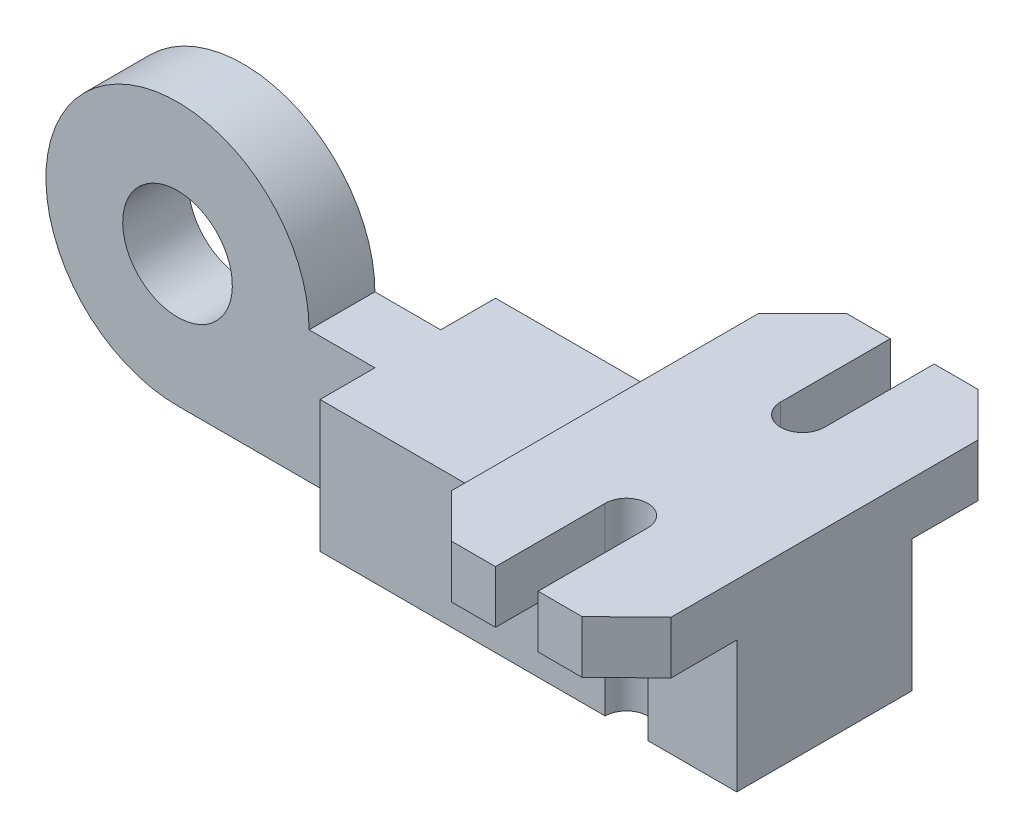
ISO-10303-21;
HEADER;
FILE_DESCRIPTION(('STEP AP214'),'2;1');
FILE_NAME('part.step','',(''),(''),'','','');
FILE_SCHEMA(('AUTOMOTIVE_DESIGN { 1 0 10303 214 1 1 1 1 }'));
ENDSEC;
DATA;
#1=APPLICATION_CONTEXT('core data for automotive mechanical design processes');
#2=APPLICATION_PROTOCOL_DEFINITION('international standard','automotive_design',2000,#1);
#3=PRODUCT_CONTEXT('',#1,'mechanical');
#4=PRODUCT('Part','Part','',(#3));
#5=PRODUCT_RELATED_PRODUCT_CATEGORY('part','',(#4));
#6=PRODUCT_DEFINITION_FORMATION('','',#4);
#7=PRODUCT_DEFINITION_CONTEXT('part definition',#1,'design');
#8=PRODUCT_DEFINITION('design','',#6,#7);
#9=PRODUCT_DEFINITION_SHAPE('','',#8);
#10=(LENGTH_UNIT() NAMED_UNIT(*) SI_UNIT(.MILLI.,.METRE.));
#11=(NAMED_UNIT(*) PLANE_ANGLE_UNIT() SI_UNIT($,.RADIAN.));
#12=(NAMED_UNIT(*) SI_UNIT($,.STERADIAN.) SOLID_ANGLE_UNIT());
#13=UNCERTAINTY_MEASURE_WITH_UNIT(LENGTH_MEASURE(1.E-05),#10,'distance_accuracy_value','');
#14=(GEOMETRIC_REPRESENTATION_CONTEXT(3) GLOBAL_UNCERTAINTY_ASSIGNED_CONTEXT((#13)) GLOBAL_UNIT_ASSIGNED_CONTEXT((#10,
#11,#12)) REPRESENTATION_CONTEXT('',''));
#15=CARTESIAN_POINT('',(0.,0.,0.));
#16=DIRECTION('',(0.,0.,1.));
#17=DIRECTION('',(1.,0.,0.));
#18=AXIS2_PLACEMENT_3D('',#15,#16,#17);
#19=CARTESIAN_POINT('',(-97.5813084364337,0.,0.));
#20=DIRECTION('',(1.,0.,0.));
#21=DIRECTION('',(0.,0.,-1.));
#22=AXIS2_PLACEMENT_3D('',#19,#20,#21);
#23=PLANE('',#22);
#24=DIRECTION('',(0.,-1.,0.));
#25=VECTOR('',#24,1.);
#26=CARTESIAN_POINT('',(-97.5813084364337,0.,13.0693866368896));
#27=LINE('',#26,#25);
#28=CARTESIAN_POINT('',(-97.5813084364337,0.,13.0693866368896));
#29=VERTEX_POINT('',#28);
#30=CARTESIAN_POINT('',(-97.5813084364337,-30.,13.0693866368896));
#31=VERTEX_POINT('',#30);
#32=EDGE_CURVE('E243',#29,#31,#27,.T.);
#33=ORIENTED_EDGE('',*,*,#32,.F.);
#34=DIRECTION('',(0.,0.,1.));
#35=VECTOR('',#34,1.);
#36=CARTESIAN_POINT('',(-97.5813084364337,0.,40.5693866368896));
#37=LINE('',#36,#35);
#38=CARTESIAN_POINT('',(-97.5813084364337,0.,0.569386636889586));
#39=VERTEX_POINT('',#38);
#40=EDGE_CURVE('E270',#39,#29,#37,.T.);
#41=ORIENTED_EDGE('',*,*,#40,.F.);
#42=DIRECTION('',(0.,1.,0.));
#43=VECTOR('',#42,1.);
#44=CARTESIAN_POINT('',(-97.5813084364337,0.,0.569386636889586));
#45=LINE('',#44,#43);
#46=CARTESIAN_POINT('',(-97.5813084364337,-30.,0.569386636889581));
#47=VERTEX_POINT('',#46);
#48=EDGE_CURVE('E266',#47,#39,#45,.T.);
#49=ORIENTED_EDGE('',*,*,#48,.F.);
#50=DIRECTION('',(0.,0.,-1.));
#51=VECTOR('',#50,1.);
#52=CARTESIAN_POINT('',(-97.5813084364337,-30.,40.5693866368896));
#53=LINE('',#52,#51);
#54=EDGE_CURVE('E263',#31,#47,#53,.T.);
#55=ORIENTED_EDGE('',*,*,#54,.F.);
#56=EDGE_LOOP('',(#33,#41,#49,#55));
#57=FACE_BOUND('',#56,.T.);
#58=ADVANCED_FACE('F39',(#57),#23,.F.);
#59=CARTESIAN_POINT('',(-97.5813084364337,0.,40.5693866368896));
#60=DIRECTION('',(0.,0.,1.));
#61=DIRECTION('',(0.,-1.,0.));
#62=AXIS2_PLACEMENT_3D('',#59,#60,#61);
#63=PLANE('',#62);
#64=DIRECTION('',(0.,1.,0.));
#65=VECTOR('',#64,1.);
#66=CARTESIAN_POINT('',(-22.8699736654861,-83.,40.5693866368896));
#67=LINE('',#66,#65);
#68=CARTESIAN_POINT('',(-22.8699736654861,-30.,40.5693866368896));
#69=VERTEX_POINT('',#68);
#70=CARTESIAN_POINT('',(-22.8699736654861,0.,40.5693866368896));
#71=VERTEX_POINT('',#70);
#72=EDGE_CURVE('E254',#69,#71,#67,.T.);
#73=ORIENTED_EDGE('',*,*,#72,.F.);
#74=DIRECTION('',(1.,0.,0.));
#75=VECTOR('',#74,1.);
#76=CARTESIAN_POINT('',(-97.5813084364337,-30.,40.5693866368896));
#77=LINE('',#76,#75);
#78=CARTESIAN_POINT('',(-2.58130843643368,-30.,40.5693866368896));
#79=VERTEX_POINT('',#78);
#80=EDGE_CURVE('E273',#69,#79,#77,.T.);
#81=ORIENTED_EDGE('',*,*,#80,.T.);
#82=DIRECTION('',(0.,-1.,0.));
#83=VECTOR('',#82,1.);
#84=CARTESIAN_POINT('',(-2.58130843643368,0.,40.5693866368896));
#85=LINE('',#84,#83);
#86=CARTESIAN_POINT('',(-2.58130843643368,0.,40.5693866368896));
#87=VERTEX_POINT('',#86);
#88=EDGE_CURVE('E259',#87,#79,#85,.T.);
#89=ORIENTED_EDGE('',*,*,#88,.F.);
#90=DIRECTION('',(1.,0.,0.));
#91=VECTOR('',#90,1.);
#92=CARTESIAN_POINT('',(-97.5813084364337,0.,40.5693866368896));
#93=LINE('',#92,#91);
#94=EDGE_CURVE('E287',#71,#87,#93,.T.);
#95=ORIENTED_EDGE('',*,*,#94,.F.);
#96=EDGE_LOOP('',(#73,#81,#89,#95));
#97=FACE_BOUND('',#96,.T.);
#98=ADVANCED_FACE('F456',(#97),#63,.T.);
#99=CARTESIAN_POINT('',(-97.5813084364337,0.,0.569386636889586));
#100=DIRECTION('',(0.,0.,-1.));
#101=DIRECTION('',(0.,1.,0.));
#102=AXIS2_PLACEMENT_3D('',#99,#100,#101);
#103=PLANE('',#102);
#104=DIRECTION('',(0.,1.,0.));
#105=VECTOR('',#104,1.);
#106=CARTESIAN_POINT('',(-32.5813084364337,-83.,0.569386636889564));
#107=LINE('',#106,#105);
#108=CARTESIAN_POINT('',(-32.5813084364337,-30.,0.569386636889573));
#109=VERTEX_POINT('',#108);
#110=CARTESIAN_POINT('',(-32.5813084364337,0.,0.569386636889564));
#111=VERTEX_POINT('',#110);
#112=EDGE_CURVE('E257',#109,#111,#107,.T.);
#113=ORIENTED_EDGE('',*,*,#112,.F.);
#114=DIRECTION('',(1.,0.,0.));
#115=VECTOR('',#114,1.);
#116=CARTESIAN_POINT('',(-97.5813084364337,-30.,0.569386636889581));
#117=LINE('',#116,#115);
#118=EDGE_CURVE('E290',#47,#109,#117,.T.);
#119=ORIENTED_EDGE('',*,*,#118,.F.);
#120=ORIENTED_EDGE('',*,*,#48,.T.);
#121=DIRECTION('',(1.,0.,0.));
#122=VECTOR('',#121,1.);
#123=CARTESIAN_POINT('',(-97.5813084364337,0.,0.569386636889586));
#124=LINE('',#123,#122);
#125=CARTESIAN_POINT('',(-52.5813084364337,0.,0.569386636889581));
#126=VERTEX_POINT('',#125);
#127=EDGE_CURVE('E285',#39,#126,#124,.T.);
#128=ORIENTED_EDGE('',*,*,#127,.T.);
#129=EDGE_CURVE('E291',#126,#111,#124,.T.);
#130=ORIENTED_EDGE('',*,*,#129,.T.);
#131=EDGE_LOOP('',(#113,#119,#120,#128,#130));
#132=FACE_BOUND('',#131,.T.);
#133=ADVANCED_FACE('F500',(#132),#103,.T.);
#134=CARTESIAN_POINT('',(-27.5813084364337,0.,0.569386636889549));
#135=DIRECTION('',(0.,1.,0.));
#136=DIRECTION('',(0.,0.,1.));
#137=AXIS2_PLACEMENT_3D('',#134,#135,#136);
#138=PLANE('',#137);
#139=ORIENTED_EDGE('',*,*,#129,.F.);
#140=DIRECTION('',(0.,0.,1.));
#141=VECTOR('',#140,1.);
#142=CARTESIAN_POINT('',(-52.5813084364337,0.,-14.4306133631105));
#143=LINE('',#142,#141);
#144=CARTESIAN_POINT('',(-52.5813084364337,0.,-14.4306133631105));
#145=VERTEX_POINT('',#144);
#146=EDGE_CURVE('E341',#145,#126,#143,.T.);
#147=ORIENTED_EDGE('',*,*,#146,.F.);
#148=DIRECTION('',(-0.707106781186548,0.,0.707106781186547));
#149=VECTOR('',#148,1.);
#150=CARTESIAN_POINT('',(-42.5813084364337,0.,-24.4306133631104));
#151=LINE('',#150,#149);
#152=CARTESIAN_POINT('',(-42.5813084364337,0.,-24.4306133631104));
#153=VERTEX_POINT('',#152);
#154=EDGE_CURVE('E338',#153,#145,#151,.T.);
#155=ORIENTED_EDGE('',*,*,#154,.F.);
#156=DIRECTION('',(-1.,0.,0.));
#157=VECTOR('',#156,1.);
#158=CARTESIAN_POINT('',(-32.5813084364337,0.,-24.4306133631105));
#159=LINE('',#158,#157);
#160=CARTESIAN_POINT('',(-32.5813084364337,0.,-24.4306133631105));
#161=VERTEX_POINT('',#160);
#162=EDGE_CURVE('E336',#161,#153,#159,.T.);
#163=ORIENTED_EDGE('',*,*,#162,.F.);
#164=DIRECTION('',(0.,0.,-1.));
#165=VECTOR('',#164,1.);
#166=CARTESIAN_POINT('',(-32.5813084364337,0.,-24.4306133631105));
#167=LINE('',#166,#165);
#168=EDGE_CURVE('E284',#111,#161,#167,.T.);
#169=ORIENTED_EDGE('',*,*,#168,.F.);
#170=EDGE_LOOP('',(#139,#147,#155,#163,#169));
#171=FACE_BOUND('',#170,.T.);
#172=ADVANCED_FACE('F506',(#171),#138,.F.);
#173=CARTESIAN_POINT('',(-22.5813084364337,0.,0.569386636889562));
#174=VERTEX_POINT('',#173);
#175=CARTESIAN_POINT('',(-2.58130843643369,0.,0.569386636889574));
#176=VERTEX_POINT('',#175);
#177=EDGE_CURVE('E292',#174,#176,#124,.T.);
#178=ORIENTED_EDGE('',*,*,#177,.F.);
#179=DIRECTION('',(0.,0.,1.));
#180=VECTOR('',#179,1.);
#181=CARTESIAN_POINT('',(-22.5813084364337,0.,-24.4306133631103));
#182=LINE('',#181,#180);
#183=CARTESIAN_POINT('',(-22.5813084364337,0.,-24.4306133631103));
#184=VERTEX_POINT('',#183);
#185=EDGE_CURVE('E303',#184,#174,#182,.T.);
#186=ORIENTED_EDGE('',*,*,#185,.F.);
#187=DIRECTION('',(-1.,0.,0.));
#188=VECTOR('',#187,1.);
#189=CARTESIAN_POINT('',(-22.5813084364337,0.,-24.4306133631103));
#190=LINE('',#189,#188);
#191=CARTESIAN_POINT('',(-12.5813084364337,0.,-24.4306133631104));
#192=VERTEX_POINT('',#191);
#193=EDGE_CURVE('E364',#192,#184,#190,.T.);
#194=ORIENTED_EDGE('',*,*,#193,.F.);
#195=DIRECTION('',(-0.707106781186548,0.,-0.707106781186547));
#196=VECTOR('',#195,1.);
#197=CARTESIAN_POINT('',(-12.5813084364337,0.,-24.4306133631104));
#198=LINE('',#197,#196);
#199=CARTESIAN_POINT('',(-2.58130843643369,0.,-14.4306133631104));
#200=VERTEX_POINT('',#199);
#201=EDGE_CURVE('E362',#200,#192,#198,.T.);
#202=ORIENTED_EDGE('',*,*,#201,.F.);
#203=DIRECTION('',(0.,0.,-1.));
#204=VECTOR('',#203,1.);
#205=CARTESIAN_POINT('',(-2.58130843643369,0.,-14.4306133631104));
#206=LINE('',#205,#204);
#207=EDGE_CURVE('E358',#176,#200,#206,.T.);
#208=ORIENTED_EDGE('',*,*,#207,.F.);
#209=EDGE_LOOP('',(#178,#186,#194,#202,#208));
#210=FACE_BOUND('',#209,.T.);
#211=ADVANCED_FACE('F462',(#210),#138,.F.);
#212=CARTESIAN_POINT('',(-52.5813084364337,0.,40.5693866368896));
#213=VERTEX_POINT('',#212);
#214=CARTESIAN_POINT('',(-52.5813084364337,0.,55.5693866368895));
#215=VERTEX_POINT('',#214);
#216=EDGE_CURVE('E340',#213,#215,#143,.T.);
#217=ORIENTED_EDGE('',*,*,#216,.F.);
#218=CARTESIAN_POINT('',(-32.5813084364337,0.,40.5693866368896));
#219=VERTEX_POINT('',#218);
#220=EDGE_CURVE('E286',#213,#219,#93,.T.);
#221=ORIENTED_EDGE('',*,*,#220,.T.);
#222=DIRECTION('',(0.,0.,-1.));
#223=VECTOR('',#222,1.);
#224=CARTESIAN_POINT('',(-32.5813084364337,0.,65.5693866368895));
#225=LINE('',#224,#223);
#226=CARTESIAN_POINT('',(-32.5813084364337,0.,65.5693866368895));
#227=VERTEX_POINT('',#226);
#228=EDGE_CURVE('E349',#227,#219,#225,.T.);
#229=ORIENTED_EDGE('',*,*,#228,.F.);
#230=DIRECTION('',(1.,0.,0.));
#231=VECTOR('',#230,1.);
#232=CARTESIAN_POINT('',(-42.5813084364337,0.,65.5693866368895));
#233=LINE('',#232,#231);
#234=CARTESIAN_POINT('',(-42.5813084364337,0.,65.5693866368895));
#235=VERTEX_POINT('',#234);
#236=EDGE_CURVE('E347',#235,#227,#233,.T.);
#237=ORIENTED_EDGE('',*,*,#236,.F.);
#238=DIRECTION('',(0.707106781186547,0.,0.707106781186548));
#239=VECTOR('',#238,1.);
#240=CARTESIAN_POINT('',(-52.5813084364337,0.,55.5693866368895));
#241=LINE('',#240,#239);
#242=EDGE_CURVE('E344',#215,#235,#241,.T.);
#243=ORIENTED_EDGE('',*,*,#242,.F.);
#244=EDGE_LOOP('',(#217,#221,#229,#237,#243));
#245=FACE_BOUND('',#244,.T.);
#246=ADVANCED_FACE('F674',(#245),#138,.F.);
#247=CARTESIAN_POINT('',(-32.5813084364337,12.,-24.4306133631105));
#248=DIRECTION('',(-1.,0.,0.));
#249=DIRECTION('',(0.,0.,1.));
#250=AXIS2_PLACEMENT_3D('',#247,#248,#249);
#251=PLANE('',#250);
#252=ORIENTED_EDGE('',*,*,#168,.T.);
#253=DIRECTION('',(0.,-1.,0.));
#254=VECTOR('',#253,1.);
#255=CARTESIAN_POINT('',(-32.5813084364337,12.,-24.4306133631105));
#256=LINE('',#255,#254);
#257=CARTESIAN_POINT('',(-32.5813084364337,12.,-24.4306133631105));
#258=VERTEX_POINT('',#257);
#259=EDGE_CURVE('E411',#258,#161,#256,.T.);
#260=ORIENTED_EDGE('',*,*,#259,.F.);
#261=DIRECTION('',(0.,0.,-1.));
#262=VECTOR('',#261,1.);
#263=CARTESIAN_POINT('',(-32.5813084364337,12.,-24.4306133631105));
#264=LINE('',#263,#262);
#265=CARTESIAN_POINT('',(-32.5813084364337,12.,0.569386636889548));
#266=VERTEX_POINT('',#265);
#267=EDGE_CURVE('E299',#266,#258,#264,.T.);
#268=ORIENTED_EDGE('',*,*,#267,.F.);
#269=DIRECTION('',(0.,-1.,0.));
#270=VECTOR('',#269,1.);
#271=CARTESIAN_POINT('',(-32.5813084364337,12.,0.569386636889548));
#272=LINE('',#271,#270);
#273=EDGE_CURVE('E333',#266,#111,#272,.T.);
#274=ORIENTED_EDGE('',*,*,#273,.T.);
#275=EDGE_LOOP('',(#252,#260,#268,#274));
#276=FACE_BOUND('',#275,.T.);
#277=ADVANCED_FACE('F41',(#276),#251,.F.);
#278=CARTESIAN_POINT('',(-32.5813084364337,12.,-24.4306133631105));
#279=DIRECTION('',(0.,0.,1.));
#280=DIRECTION('',(1.,0.,0.));
#281=AXIS2_PLACEMENT_3D('',#278,#279,#280);
#282=PLANE('',#281);
#283=ORIENTED_EDGE('',*,*,#162,.T.);
#284=DIRECTION('',(0.,-1.,0.));
#285=VECTOR('',#284,1.);
#286=CARTESIAN_POINT('',(-42.5813084364337,12.,-24.4306133631104));
#287=LINE('',#286,#285);
#288=CARTESIAN_POINT('',(-42.5813084364337,12.,-24.4306133631104));
#289=VERTEX_POINT('',#288);
#290=EDGE_CURVE('E408',#289,#153,#287,.T.);
#291=ORIENTED_EDGE('',*,*,#290,.F.);
#292=DIRECTION('',(-1.,0.,0.));
#293=VECTOR('',#292,1.);
#294=CARTESIAN_POINT('',(-32.5813084364337,12.,-24.4306133631105));
#295=LINE('',#294,#293);
#296=EDGE_CURVE('E302',#258,#289,#295,.T.);
#297=ORIENTED_EDGE('',*,*,#296,.F.);
#298=ORIENTED_EDGE('',*,*,#259,.T.);
#299=EDGE_LOOP('',(#283,#291,#297,#298));
#300=FACE_BOUND('',#299,.T.);
#301=ADVANCED_FACE('F519',(#300),#282,.F.);
#302=CARTESIAN_POINT('',(-42.5813084364337,12.,-24.4306133631104));
#303=DIRECTION('',(0.707106781186547,0.,0.707106781186548));
#304=DIRECTION('',(0.707106781186548,0.,-0.707106781186547));
#305=AXIS2_PLACEMENT_3D('',#302,#303,#304);
#306=PLANE('',#305);
#307=ORIENTED_EDGE('',*,*,#154,.T.);
#308=DIRECTION('',(0.,-1.,0.));
#309=VECTOR('',#308,1.);
#310=CARTESIAN_POINT('',(-52.5813084364337,12.,-14.4306133631105));
#311=LINE('',#310,#309);
#312=CARTESIAN_POINT('',(-52.5813084364337,12.,-14.4306133631105));
#313=VERTEX_POINT('',#312);
#314=EDGE_CURVE('E405',#313,#145,#311,.T.);
#315=ORIENTED_EDGE('',*,*,#314,.F.);
#316=DIRECTION('',(-0.707106781186548,0.,0.707106781186547));
#317=VECTOR('',#316,1.);
#318=CARTESIAN_POINT('',(-42.5813084364337,12.,-24.4306133631104));
#319=LINE('',#318,#317);
#320=EDGE_CURVE('E305',#289,#313,#319,.T.);
#321=ORIENTED_EDGE('',*,*,#320,.F.);
#322=ORIENTED_EDGE('',*,*,#290,.T.);
#323=EDGE_LOOP('',(#307,#315,#321,#322));
#324=FACE_BOUND('',#323,.T.);
#325=ADVANCED_FACE('F515',(#324),#306,.F.);
#326=CARTESIAN_POINT('',(-52.5813084364337,12.,-14.4306133631105));
#327=DIRECTION('',(1.,0.,0.));
#328=DIRECTION('',(0.,0.,-1.));
#329=AXIS2_PLACEMENT_3D('',#326,#327,#328);
#330=PLANE('',#329);
#331=ORIENTED_EDGE('',*,*,#146,.T.);
#332=EDGE_CURVE('E345',#126,#213,#143,.T.);
#333=ORIENTED_EDGE('',*,*,#332,.T.);
#334=ORIENTED_EDGE('',*,*,#216,.T.);
#335=DIRECTION('',(0.,-1.,0.));
#336=VECTOR('',#335,1.);
#337=CARTESIAN_POINT('',(-52.5813084364337,12.,55.5693866368895));
#338=LINE('',#337,#336);
#339=CARTESIAN_POINT('',(-52.5813084364337,12.,55.5693866368895));
#340=VERTEX_POINT('',#339);
#341=EDGE_CURVE('E402',#340,#215,#338,.T.);
#342=ORIENTED_EDGE('',*,*,#341,.F.);
#343=DIRECTION('',(0.,0.,1.));
#344=VECTOR('',#343,1.);
#345=CARTESIAN_POINT('',(-52.5813084364337,12.,-14.4306133631105));
#346=LINE('',#345,#344);
#347=EDGE_CURVE('E307',#313,#340,#346,.T.);
#348=ORIENTED_EDGE('',*,*,#347,.F.);
#349=ORIENTED_EDGE('',*,*,#314,.T.);
#350=EDGE_LOOP('',(#331,#333,#334,#342,#348,#349));
#351=FACE_BOUND('',#350,.T.);
#352=ADVANCED_FACE('F509',(#351),#330,.F.);
#353=CARTESIAN_POINT('',(-52.5813084364337,12.,55.5693866368895));
#354=DIRECTION('',(0.707106781186548,0.,-0.707106781186547));
#355=DIRECTION('',(-0.707106781186547,0.,-0.707106781186548));
#356=AXIS2_PLACEMENT_3D('',#353,#354,#355);
#357=PLANE('',#356);
#358=ORIENTED_EDGE('',*,*,#242,.T.);
#359=DIRECTION('',(0.,-1.,0.));
#360=VECTOR('',#359,1.);
#361=CARTESIAN_POINT('',(-42.5813084364337,12.,65.5693866368895));
#362=LINE('',#361,#360);
#363=CARTESIAN_POINT('',(-42.5813084364337,12.,65.5693866368895));
#364=VERTEX_POINT('',#363);
#365=EDGE_CURVE('E399',#364,#235,#362,.T.);
#366=ORIENTED_EDGE('',*,*,#365,.F.);
#367=DIRECTION('',(0.707106781186547,0.,0.707106781186548));
#368=VECTOR('',#367,1.);
#369=CARTESIAN_POINT('',(-52.5813084364337,12.,55.5693866368895));
#370=LINE('',#369,#368);
#371=EDGE_CURVE('E309',#340,#364,#370,.T.);
#372=ORIENTED_EDGE('',*,*,#371,.F.);
#373=ORIENTED_EDGE('',*,*,#341,.T.);
#374=EDGE_LOOP('',(#358,#366,#372,#373));
#375=FACE_BOUND('',#374,.T.);
#376=ADVANCED_FACE('F755',(#375),#357,.F.);
#377=CARTESIAN_POINT('',(-42.5813084364337,12.,65.5693866368895));
#378=DIRECTION('',(0.,0.,-1.));
#379=DIRECTION('',(-1.,0.,0.));
#380=AXIS2_PLACEMENT_3D('',#377,#378,#379);
#381=PLANE('',#380);
#382=ORIENTED_EDGE('',*,*,#236,.T.);
#383=DIRECTION('',(0.,-1.,0.));
#384=VECTOR('',#383,1.);
#385=CARTESIAN_POINT('',(-32.5813084364337,12.,65.5693866368895));
#386=LINE('',#385,#384);
#387=CARTESIAN_POINT('',(-32.5813084364337,12.,65.5693866368895));
#388=VERTEX_POINT('',#387);
#389=EDGE_CURVE('E396',#388,#227,#386,.T.);
#390=ORIENTED_EDGE('',*,*,#389,.F.);
#391=DIRECTION('',(1.,0.,0.));
#392=VECTOR('',#391,1.);
#393=CARTESIAN_POINT('',(-42.5813084364337,12.,65.5693866368895));
#394=LINE('',#393,#392);
#395=EDGE_CURVE('E311',#364,#388,#394,.T.);
#396=ORIENTED_EDGE('',*,*,#395,.F.);
#397=ORIENTED_EDGE('',*,*,#365,.T.);
#398=EDGE_LOOP('',(#382,#390,#396,#397));
#399=FACE_BOUND('',#398,.T.);
#400=ADVANCED_FACE('F747',(#399),#381,.F.);
#401=CARTESIAN_POINT('',(-32.5813084364337,12.,65.5693866368895));
#402=DIRECTION('',(-1.,0.,0.));
#403=DIRECTION('',(0.,0.,1.));
#404=AXIS2_PLACEMENT_3D('',#401,#402,#403);
#405=PLANE('',#404);
#406=ORIENTED_EDGE('',*,*,#228,.T.);
#407=DIRECTION('',(0.,-1.,0.));
#408=VECTOR('',#407,1.);
#409=CARTESIAN_POINT('',(-32.5813084364337,12.,40.5693866368895));
#410=LINE('',#409,#408);
#411=CARTESIAN_POINT('',(-32.5813084364337,12.,40.5693866368895));
#412=VERTEX_POINT('',#411);
#413=EDGE_CURVE('E393',#412,#219,#410,.T.);
#414=ORIENTED_EDGE('',*,*,#413,.F.);
#415=DIRECTION('',(0.,0.,-1.));
#416=VECTOR('',#415,1.);
#417=CARTESIAN_POINT('',(-32.5813084364337,12.,65.5693866368895));
#418=LINE('',#417,#416);
#419=EDGE_CURVE('E313',#388,#412,#418,.T.);
#420=ORIENTED_EDGE('',*,*,#419,.F.);
#421=ORIENTED_EDGE('',*,*,#389,.T.);
#422=EDGE_LOOP('',(#406,#414,#420,#421));
#423=FACE_BOUND('',#422,.T.);
#424=ADVANCED_FACE('F482',(#423),#405,.F.);
#425=CARTESIAN_POINT('',(-27.7256410509599,12.,40.5693866368896));
#426=DIRECTION('',(0.,-1.,0.));
#427=DIRECTION('',(0.,0.,-1.));
#428=AXIS2_PLACEMENT_3D('',#425,#426,#427);
#429=CYLINDRICAL_SURFACE('',#428,4.8556673854738);
#430=ORIENTED_EDGE('',*,*,#413,.T.);
#431=DIRECTION('',(0.,1.,0.));
#432=VECTOR('',#431,1.);
#433=CARTESIAN_POINT('',(-32.5813084364337,-83.,40.5693866368896));
#434=LINE('',#433,#432);
#435=CARTESIAN_POINT('',(-32.5813084364337,-30.,40.5693866368896));
#436=VERTEX_POINT('',#435);
#437=EDGE_CURVE('E251',#219,#436,#434,.F.);
#438=ORIENTED_EDGE('',*,*,#437,.T.);
#439=CARTESIAN_POINT('',(-27.7256410509599,-30.,40.5693866368896));
#440=DIRECTION('',(0.,-1.,0.));
#441=DIRECTION('',(0.,0.,-1.));
#442=AXIS2_PLACEMENT_3D('',#439,#440,#441);
#443=CIRCLE('',#442,4.8556673854738);
#444=EDGE_CURVE('E47',#436,#69,#443,.T.);
#445=ORIENTED_EDGE('',*,*,#444,.T.);
#446=ORIENTED_EDGE('',*,*,#72,.T.);
#447=DIRECTION('',(0.,-1.,0.));
#448=VECTOR('',#447,1.);
#449=CARTESIAN_POINT('',(-22.8699736654861,12.,40.5693866368896));
#450=LINE('',#449,#448);
#451=CARTESIAN_POINT('',(-22.8699736654861,12.,40.5693866368896));
#452=VERTEX_POINT('',#451);
#453=EDGE_CURVE('E390',#452,#71,#450,.T.);
#454=ORIENTED_EDGE('',*,*,#453,.F.);
#455=CARTESIAN_POINT('',(-27.7256410509599,12.,40.5693866368896));
#456=DIRECTION('',(0.,-1.,0.));
#457=DIRECTION('',(0.,0.,1.));
#458=AXIS2_PLACEMENT_3D('',#455,#456,#457);
#459=CIRCLE('',#458,4.8556673854738);
#460=EDGE_CURVE('E315',#412,#452,#459,.T.);
#461=ORIENTED_EDGE('',*,*,#460,.F.);
#462=EDGE_LOOP('',(#430,#438,#445,#446,#454,#461));
#463=FACE_BOUND('',#462,.T.);
#464=ADVANCED_FACE('F454',(#463),#429,.F.);
#465=CARTESIAN_POINT('',(-22.8699736654861,12.,65.5693866368896));
#466=DIRECTION('',(1.,0.,0.));
#467=DIRECTION('',(0.,0.,-1.));
#468=AXIS2_PLACEMENT_3D('',#465,#466,#467);
#469=PLANE('',#468);
#470=DIRECTION('',(0.,0.,1.));
#471=VECTOR('',#470,1.);
#472=CARTESIAN_POINT('',(-22.8699736654861,0.,65.5693866368896));
#473=LINE('',#472,#471);
#474=CARTESIAN_POINT('',(-22.8699736654861,0.,65.5693866368896));
#475=VERTEX_POINT('',#474);
#476=EDGE_CURVE('E352',#71,#475,#473,.T.);
#477=ORIENTED_EDGE('',*,*,#476,.T.);
#478=DIRECTION('',(0.,-1.,0.));
#479=VECTOR('',#478,1.);
#480=CARTESIAN_POINT('',(-22.8699736654861,12.,65.5693866368896));
#481=LINE('',#480,#479);
#482=CARTESIAN_POINT('',(-22.8699736654861,12.,65.5693866368896));
#483=VERTEX_POINT('',#482);
#484=EDGE_CURVE('E387',#483,#475,#481,.T.);
#485=ORIENTED_EDGE('',*,*,#484,.F.);
#486=DIRECTION('',(0.,0.,1.));
#487=VECTOR('',#486,1.);
#488=CARTESIAN_POINT('',(-22.8699736654861,12.,65.5693866368896));
#489=LINE('',#488,#487);
#490=EDGE_CURVE('E317',#452,#483,#489,.T.);
#491=ORIENTED_EDGE('',*,*,#490,.F.);
#492=ORIENTED_EDGE('',*,*,#453,.T.);
#493=EDGE_LOOP('',(#477,#485,#491,#492));
#494=FACE_BOUND('',#493,.T.);
#495=ADVANCED_FACE('F451',(#494),#469,.F.);
#496=CARTESIAN_POINT('',(-12.8699736654861,12.,65.5693866368896));
#497=DIRECTION('',(0.,0.,-1.));
#498=DIRECTION('',(-1.,0.,0.));
#499=AXIS2_PLACEMENT_3D('',#496,#497,#498);
#500=PLANE('',#499);
#501=DIRECTION('',(1.,0.,0.));
#502=VECTOR('',#501,1.);
#503=CARTESIAN_POINT('',(-12.8699736654861,0.,65.5693866368896));
#504=LINE('',#503,#502);
#505=CARTESIAN_POINT('',(-12.8699736654861,0.,65.5693866368896));
#506=VERTEX_POINT('',#505);
#507=EDGE_CURVE('E354',#475,#506,#504,.T.);
#508=ORIENTED_EDGE('',*,*,#507,.T.);
#509=DIRECTION('',(0.,-1.,0.));
#510=VECTOR('',#509,1.);
#511=CARTESIAN_POINT('',(-12.8699736654861,12.,65.5693866368896));
#512=LINE('',#511,#510);
#513=CARTESIAN_POINT('',(-12.8699736654861,12.,65.5693866368896));
#514=VERTEX_POINT('',#513);
#515=EDGE_CURVE('E384',#514,#506,#512,.T.);
#516=ORIENTED_EDGE('',*,*,#515,.F.);
#517=DIRECTION('',(1.,0.,0.));
#518=VECTOR('',#517,1.);
#519=CARTESIAN_POINT('',(-12.8699736654861,12.,65.5693866368896));
#520=LINE('',#519,#518);
#521=EDGE_CURVE('E319',#483,#514,#520,.T.);
#522=ORIENTED_EDGE('',*,*,#521,.F.);
#523=ORIENTED_EDGE('',*,*,#484,.T.);
#524=EDGE_LOOP('',(#508,#516,#522,#523));
#525=FACE_BOUND('',#524,.T.);
#526=ADVANCED_FACE('F446',(#525),#500,.F.);
#527=CARTESIAN_POINT('',(-2.58130843643368,12.,55.5693866368896));
#528=DIRECTION('',(-0.69697559014587,0.,-0.717094851983206));
#529=DIRECTION('',(-0.717094851983206,0.,0.69697559014587));
#530=AXIS2_PLACEMENT_3D('',#527,#528,#529);
#531=PLANE('',#530);
#532=DIRECTION('',(0.717094851983207,0.,-0.69697559014587));
#533=VECTOR('',#532,1.);
#534=CARTESIAN_POINT('',(-2.58130843643368,0.,55.5693866368896));
#535=LINE('',#534,#533);
#536=CARTESIAN_POINT('',(-2.58130843643368,0.,55.5693866368896));
#537=VERTEX_POINT('',#536);
#538=EDGE_CURVE('E356',#506,#537,#535,.T.);
#539=ORIENTED_EDGE('',*,*,#538,.T.);
#540=DIRECTION('',(0.,-1.,0.));
#541=VECTOR('',#540,1.);
#542=CARTESIAN_POINT('',(-2.58130843643368,12.,55.5693866368896));
#543=LINE('',#542,#541);
#544=CARTESIAN_POINT('',(-2.58130843643368,12.,55.5693866368896));
#545=VERTEX_POINT('',#544);
#546=EDGE_CURVE('E381',#545,#537,#543,.T.);
#547=ORIENTED_EDGE('',*,*,#546,.F.);
#548=DIRECTION('',(0.717094851983207,0.,-0.69697559014587));
#549=VECTOR('',#548,1.);
#550=CARTESIAN_POINT('',(-2.58130843643368,12.,55.5693866368896));
#551=LINE('',#550,#549);
#552=EDGE_CURVE('E321',#514,#545,#551,.T.);
#553=ORIENTED_EDGE('',*,*,#552,.F.);
#554=ORIENTED_EDGE('',*,*,#515,.T.);
#555=EDGE_LOOP('',(#539,#547,#553,#554));
#556=FACE_BOUND('',#555,.T.);
#557=ADVANCED_FACE('F443',(#556),#531,.F.);
#558=CARTESIAN_POINT('',(-2.58130843643369,12.,-14.4306133631104));
#559=DIRECTION('',(-1.,0.,0.));
#560=DIRECTION('',(0.,0.,1.));
#561=AXIS2_PLACEMENT_3D('',#558,#559,#560);
#562=PLANE('',#561);
#563=EDGE_CURVE('E359',#537,#87,#206,.T.);
#564=ORIENTED_EDGE('',*,*,#563,.T.);
#565=ORIENTED_EDGE('',*,*,#88,.T.);
#566=DIRECTION('',(0.,0.,-1.));
#567=VECTOR('',#566,1.);
#568=CARTESIAN_POINT('',(-2.58130843643368,-30.,40.5693866368896));
#569=LINE('',#568,#567);
#570=CARTESIAN_POINT('',(-2.58130843643369,-30.,0.569386636889569));
#571=VERTEX_POINT('',#570);
#572=EDGE_CURVE('E276',#79,#571,#569,.T.);
#573=ORIENTED_EDGE('',*,*,#572,.T.);
#574=DIRECTION('',(0.,1.,0.));
#575=VECTOR('',#574,1.);
#576=CARTESIAN_POINT('',(-2.58130843643369,0.,0.569386636889574));
#577=LINE('',#576,#575);
#578=EDGE_CURVE('E264',#571,#176,#577,.T.);
#579=ORIENTED_EDGE('',*,*,#578,.T.);
#580=ORIENTED_EDGE('',*,*,#207,.T.);
#581=DIRECTION('',(0.,-1.,0.));
#582=VECTOR('',#581,1.);
#583=CARTESIAN_POINT('',(-2.58130843643369,12.,-14.4306133631104));
#584=LINE('',#583,#582);
#585=CARTESIAN_POINT('',(-2.58130843643369,12.,-14.4306133631104));
#586=VERTEX_POINT('',#585);
#587=EDGE_CURVE('E378',#586,#200,#584,.T.);
#588=ORIENTED_EDGE('',*,*,#587,.F.);
#589=DIRECTION('',(0.,0.,-1.));
#590=VECTOR('',#589,1.);
#591=CARTESIAN_POINT('',(-2.58130843643369,12.,-14.4306133631104));
#592=LINE('',#591,#590);
#593=EDGE_CURVE('E323',#545,#586,#592,.T.);
#594=ORIENTED_EDGE('',*,*,#593,.F.);
#595=ORIENTED_EDGE('',*,*,#546,.T.);
#596=EDGE_LOOP('',(#564,#565,#573,#579,#580,#588,#594,#595));
#597=FACE_BOUND('',#596,.T.);
#598=ADVANCED_FACE('F437',(#597),#562,.F.);
#599=CARTESIAN_POINT('',(-12.5813084364337,12.,-24.4306133631104));
#600=DIRECTION('',(-0.707106781186547,0.,0.707106781186548));
#601=DIRECTION('',(0.707106781186548,0.,0.707106781186547));
#602=AXIS2_PLACEMENT_3D('',#599,#600,#601);
#603=PLANE('',#602);
#604=ORIENTED_EDGE('',*,*,#201,.T.);
#605=DIRECTION('',(0.,-1.,0.));
#606=VECTOR('',#605,1.);
#607=CARTESIAN_POINT('',(-12.5813084364337,12.,-24.4306133631104));
#608=LINE('',#607,#606);
#609=CARTESIAN_POINT('',(-12.5813084364337,12.,-24.4306133631104));
#610=VERTEX_POINT('',#609);
#611=EDGE_CURVE('E375',#610,#192,#608,.T.);
#612=ORIENTED_EDGE('',*,*,#611,.F.);
#613=DIRECTION('',(-0.707106781186548,0.,-0.707106781186547));
#614=VECTOR('',#613,1.);
#615=CARTESIAN_POINT('',(-12.5813084364337,12.,-24.4306133631104));
#616=LINE('',#615,#614);
#617=EDGE_CURVE('E325',#586,#610,#616,.T.);
#618=ORIENTED_EDGE('',*,*,#617,.F.);
#619=ORIENTED_EDGE('',*,*,#587,.T.);
#620=EDGE_LOOP('',(#604,#612,#618,#619));
#621=FACE_BOUND('',#620,.T.);
#622=ADVANCED_FACE('F467',(#621),#603,.F.);
#623=CARTESIAN_POINT('',(-22.5813084364337,12.,-24.4306133631103));
#624=DIRECTION('',(0.,0.,1.));
#625=DIRECTION('',(1.,0.,0.));
#626=AXIS2_PLACEMENT_3D('',#623,#624,#625);
#627=PLANE('',#626);
#628=ORIENTED_EDGE('',*,*,#193,.T.);
#629=DIRECTION('',(0.,-1.,0.));
#630=VECTOR('',#629,1.);
#631=CARTESIAN_POINT('',(-22.5813084364337,12.,-24.4306133631103));
#632=LINE('',#631,#630);
#633=CARTESIAN_POINT('',(-22.5813084364337,12.,-24.4306133631103));
#634=VERTEX_POINT('',#633);
#635=EDGE_CURVE('E372',#634,#184,#632,.T.);
#636=ORIENTED_EDGE('',*,*,#635,.F.);
#637=DIRECTION('',(-1.,0.,0.));
#638=VECTOR('',#637,1.);
#639=CARTESIAN_POINT('',(-22.5813084364337,12.,-24.4306133631103));
#640=LINE('',#639,#638);
#641=EDGE_CURVE('E327',#610,#634,#640,.T.);
#642=ORIENTED_EDGE('',*,*,#641,.F.);
#643=ORIENTED_EDGE('',*,*,#611,.T.);
#644=EDGE_LOOP('',(#628,#636,#642,#643));
#645=FACE_BOUND('',#644,.T.);
#646=ADVANCED_FACE('F471',(#645),#627,.F.);
#647=CARTESIAN_POINT('',(-22.5813084364337,12.,-24.4306133631103));
#648=DIRECTION('',(1.,0.,0.));
#649=DIRECTION('',(0.,0.,-1.));
#650=AXIS2_PLACEMENT_3D('',#647,#648,#649);
#651=PLANE('',#650);
#652=ORIENTED_EDGE('',*,*,#185,.T.);
#653=DIRECTION('',(0.,-1.,0.));
#654=VECTOR('',#653,1.);
#655=CARTESIAN_POINT('',(-22.5813084364337,12.,0.569386636889602));
#656=LINE('',#655,#654);
#657=CARTESIAN_POINT('',(-22.5813084364337,12.,0.569386636889602));
#658=VERTEX_POINT('',#657);
#659=EDGE_CURVE('E370',#658,#174,#656,.T.);
#660=ORIENTED_EDGE('',*,*,#659,.F.);
#661=DIRECTION('',(0.,0.,1.));
#662=VECTOR('',#661,1.);
#663=CARTESIAN_POINT('',(-22.5813084364337,12.,-24.4306133631103));
#664=LINE('',#663,#662);
#665=EDGE_CURVE('E329',#634,#658,#664,.T.);
#666=ORIENTED_EDGE('',*,*,#665,.F.);
#667=ORIENTED_EDGE('',*,*,#635,.T.);
#668=EDGE_LOOP('',(#652,#660,#666,#667));
#669=FACE_BOUND('',#668,.T.);
#670=ADVANCED_FACE('F615',(#669),#651,.F.);
#671=CARTESIAN_POINT('',(-27.5813084364337,12.,0.569386636889549));
#672=DIRECTION('',(0.,-1.,0.));
#673=DIRECTION('',(0.,0.,-1.));
#674=AXIS2_PLACEMENT_3D('',#671,#672,#673);
#675=CYLINDRICAL_SURFACE('',#674,5.);
#676=ORIENTED_EDGE('',*,*,#659,.T.);
#677=DIRECTION('',(0.,1.,0.));
#678=VECTOR('',#677,1.);
#679=CARTESIAN_POINT('',(-22.5813084364337,-83.,0.569386636889562));
#680=LINE('',#679,#678);
#681=CARTESIAN_POINT('',(-22.5813084364337,-30.,0.569386636889572));
#682=VERTEX_POINT('',#681);
#683=EDGE_CURVE('E61',#174,#682,#680,.F.);
#684=ORIENTED_EDGE('',*,*,#683,.T.);
#685=CARTESIAN_POINT('',(-27.5813084364337,-30.,0.569386636889577));
#686=DIRECTION('',(0.,-1.,0.));
#687=DIRECTION('',(0.,0.,-1.));
#688=AXIS2_PLACEMENT_3D('',#685,#686,#687);
#689=CIRCLE('',#688,4.99999999999999);
#690=EDGE_CURVE('E11',#682,#109,#689,.T.);
#691=ORIENTED_EDGE('',*,*,#690,.T.);
#692=ORIENTED_EDGE('',*,*,#112,.T.);
#693=ORIENTED_EDGE('',*,*,#273,.F.);
#694=CARTESIAN_POINT('',(-27.5813084364337,12.,0.569386636889549));
#695=DIRECTION('',(0.,-1.,0.));
#696=DIRECTION('',(0.,0.,1.));
#697=AXIS2_PLACEMENT_3D('',#694,#695,#696);
#698=CIRCLE('',#697,5.);
#699=EDGE_CURVE('E331',#658,#266,#698,.T.);
#700=ORIENTED_EDGE('',*,*,#699,.F.);
#701=EDGE_LOOP('',(#676,#684,#691,#692,#693,#700));
#702=FACE_BOUND('',#701,.T.);
#703=ADVANCED_FACE('F524',(#702),#675,.F.);
#704=CARTESIAN_POINT('',(-27.5813084364337,12.,0.569386636889549));
#705=DIRECTION('',(0.,1.,0.));
#706=DIRECTION('',(0.,0.,1.));
#707=AXIS2_PLACEMENT_3D('',#704,#705,#706);
#708=PLANE('',#707);
#709=ORIENTED_EDGE('',*,*,#267,.T.);
#710=ORIENTED_EDGE('',*,*,#296,.T.);
#711=ORIENTED_EDGE('',*,*,#320,.T.);
#712=ORIENTED_EDGE('',*,*,#347,.T.);
#713=ORIENTED_EDGE('',*,*,#371,.T.);
#714=ORIENTED_EDGE('',*,*,#395,.T.);
#715=ORIENTED_EDGE('',*,*,#419,.T.);
#716=ORIENTED_EDGE('',*,*,#460,.T.);
#717=ORIENTED_EDGE('',*,*,#490,.T.);
#718=ORIENTED_EDGE('',*,*,#521,.T.);
#719=ORIENTED_EDGE('',*,*,#552,.T.);
#720=ORIENTED_EDGE('',*,*,#593,.T.);
#721=ORIENTED_EDGE('',*,*,#617,.T.);
#722=ORIENTED_EDGE('',*,*,#641,.T.);
#723=ORIENTED_EDGE('',*,*,#665,.T.);
#724=ORIENTED_EDGE('',*,*,#699,.T.);
#725=EDGE_LOOP('',(#709,#710,#711,#712,#713,#714,#715,#716,#717,#718,#719,#720,#721,#722,#723,#724));
#726=FACE_BOUND('',#725,.T.);
#727=ADVANCED_FACE('F475',(#726),#708,.T.);
#728=ORIENTED_EDGE('',*,*,#476,.F.);
#729=ORIENTED_EDGE('',*,*,#94,.T.);
#730=ORIENTED_EDGE('',*,*,#563,.F.);
#731=ORIENTED_EDGE('',*,*,#538,.F.);
#732=ORIENTED_EDGE('',*,*,#507,.F.);
#733=EDGE_LOOP('',(#728,#729,#730,#731,#732));
#734=FACE_BOUND('',#733,.T.);
#735=ADVANCED_FACE('F432',(#734),#138,.F.);
#736=CARTESIAN_POINT('',(-97.5813084364337,0.,40.5693866368896));
#737=DIRECTION('',(0.,1.,0.));
#738=DIRECTION('',(0.,0.,1.));
#739=AXIS2_PLACEMENT_3D('',#736,#737,#738);
#740=PLANE('',#739);
#741=ORIENTED_EDGE('',*,*,#332,.F.);
#742=ORIENTED_EDGE('',*,*,#127,.F.);
#743=ORIENTED_EDGE('',*,*,#40,.T.);
#744=DIRECTION('',(1.,0.,0.));
#745=VECTOR('',#744,1.);
#746=CARTESIAN_POINT('',(-97.5813084364337,0.,13.0693866368896));
#747=LINE('',#746,#745);
#748=CARTESIAN_POINT('',(-112.581308436434,0.,13.0693866368896));
#749=VERTEX_POINT('',#748);
#750=EDGE_CURVE('E238',#749,#29,#747,.T.);
#751=ORIENTED_EDGE('',*,*,#750,.F.);
#752=DIRECTION('',(0.,0.,-1.));
#753=VECTOR('',#752,1.);
#754=CARTESIAN_POINT('',(-112.581308436434,0.,28.0693866368896));
#755=LINE('',#754,#753);
#756=CARTESIAN_POINT('',(-112.581308436434,0.,28.0693866368896));
#757=VERTEX_POINT('',#756);
#758=EDGE_CURVE('E226',#757,#749,#755,.T.);
#759=ORIENTED_EDGE('',*,*,#758,.F.);
#760=DIRECTION('',(1.,0.,0.));
#761=VECTOR('',#760,1.);
#762=CARTESIAN_POINT('',(-97.5813084364337,0.,28.0693866368896));
#763=LINE('',#762,#761);
#764=CARTESIAN_POINT('',(-97.5813084364337,0.,28.0693866368896));
#765=VERTEX_POINT('',#764);
#766=EDGE_CURVE('E227',#757,#765,#763,.T.);
#767=ORIENTED_EDGE('',*,*,#766,.T.);
#768=CARTESIAN_POINT('',(-97.5813084364337,0.,40.5693866368896));
#769=VERTEX_POINT('',#768);
#770=EDGE_CURVE('E269',#765,#769,#37,.T.);
#771=ORIENTED_EDGE('',*,*,#770,.T.);
#772=EDGE_CURVE('E281',#769,#213,#93,.T.);
#773=ORIENTED_EDGE('',*,*,#772,.T.);
#774=EDGE_LOOP('',(#741,#742,#743,#751,#759,#767,#771,#773));
#775=FACE_BOUND('',#774,.T.);
#776=ADVANCED_FACE('F491',(#775),#740,.T.);
#777=ORIENTED_EDGE('',*,*,#437,.F.);
#778=ORIENTED_EDGE('',*,*,#220,.F.);
#779=ORIENTED_EDGE('',*,*,#772,.F.);
#780=DIRECTION('',(0.,-1.,0.));
#781=VECTOR('',#780,1.);
#782=CARTESIAN_POINT('',(-97.5813084364337,0.,40.5693866368896));
#783=LINE('',#782,#781);
#784=CARTESIAN_POINT('',(-97.5813084364337,-30.,40.5693866368896));
#785=VERTEX_POINT('',#784);
#786=EDGE_CURVE('E260',#769,#785,#783,.T.);
#787=ORIENTED_EDGE('',*,*,#786,.T.);
#788=EDGE_CURVE('E296',#785,#436,#77,.T.);
#789=ORIENTED_EDGE('',*,*,#788,.T.);
#790=EDGE_LOOP('',(#777,#778,#779,#787,#789));
#791=FACE_BOUND('',#790,.T.);
#792=ADVANCED_FACE('F484',(#791),#63,.T.);
#793=ORIENTED_EDGE('',*,*,#683,.F.);
#794=ORIENTED_EDGE('',*,*,#177,.T.);
#795=ORIENTED_EDGE('',*,*,#578,.F.);
#796=EDGE_CURVE('E295',#682,#571,#117,.T.);
#797=ORIENTED_EDGE('',*,*,#796,.F.);
#798=EDGE_LOOP('',(#793,#794,#795,#797));
#799=FACE_BOUND('',#798,.T.);
#800=ADVANCED_FACE('F525',(#799),#103,.T.);
#801=CARTESIAN_POINT('',(-97.5813084364337,-30.,40.5693866368896));
#802=DIRECTION('',(0.,-1.,0.));
#803=DIRECTION('',(0.,0.,-1.));
#804=AXIS2_PLACEMENT_3D('',#801,#802,#803);
#805=PLANE('',#804);
#806=ORIENTED_EDGE('',*,*,#690,.F.);
#807=ORIENTED_EDGE('',*,*,#796,.T.);
#808=ORIENTED_EDGE('',*,*,#572,.F.);
#809=ORIENTED_EDGE('',*,*,#80,.F.);
#810=ORIENTED_EDGE('',*,*,#444,.F.);
#811=ORIENTED_EDGE('',*,*,#788,.F.);
#812=CARTESIAN_POINT('',(-97.5813084364337,-30.,28.0693866368896));
#813=VERTEX_POINT('',#812);
#814=EDGE_CURVE('E235',#785,#813,#53,.T.);
#815=ORIENTED_EDGE('',*,*,#814,.T.);
#816=DIRECTION('',(-1.,0.,0.));
#817=VECTOR('',#816,1.);
#818=CARTESIAN_POINT('',(-97.5813084364337,-30.,28.0693866368896));
#819=LINE('',#818,#817);
#820=CARTESIAN_POINT('',(-142.581308436434,-30.,28.0693866368896));
#821=VERTEX_POINT('',#820);
#822=EDGE_CURVE('E54',#813,#821,#819,.T.);
#823=ORIENTED_EDGE('',*,*,#822,.T.);
#824=DIRECTION('',(0.,0.,-1.));
#825=VECTOR('',#824,1.);
#826=CARTESIAN_POINT('',(-142.581308436434,-30.,28.0693866368896));
#827=LINE('',#826,#825);
#828=CARTESIAN_POINT('',(-142.581308436434,-30.,13.0693866368896));
#829=VERTEX_POINT('',#828);
#830=EDGE_CURVE('E218',#821,#829,#827,.T.);
#831=ORIENTED_EDGE('',*,*,#830,.T.);
#832=DIRECTION('',(-1.,0.,0.));
#833=VECTOR('',#832,1.);
#834=CARTESIAN_POINT('',(-97.5813084364337,-30.,13.0693866368896));
#835=LINE('',#834,#833);
#836=EDGE_CURVE('E246',#31,#829,#835,.T.);
#837=ORIENTED_EDGE('',*,*,#836,.F.);
#838=ORIENTED_EDGE('',*,*,#54,.T.);
#839=ORIENTED_EDGE('',*,*,#118,.T.);
#840=EDGE_LOOP('',(#806,#807,#808,#809,#810,#811,#815,#823,#831,#837,#838,#839));
#841=FACE_BOUND('',#840,.T.);
#842=ADVANCED_FACE('F233',(#841),#805,.T.);
#843=ORIENTED_EDGE('',*,*,#770,.F.);
#844=DIRECTION('',(0.,-1.,0.));
#845=VECTOR('',#844,1.);
#846=CARTESIAN_POINT('',(-97.5813084364337,0.,28.0693866368896));
#847=LINE('',#846,#845);
#848=EDGE_CURVE('E236',#765,#813,#847,.T.);
#849=ORIENTED_EDGE('',*,*,#848,.T.);
#850=ORIENTED_EDGE('',*,*,#814,.F.);
#851=ORIENTED_EDGE('',*,*,#786,.F.);
#852=EDGE_LOOP('',(#843,#849,#850,#851));
#853=FACE_BOUND('',#852,.T.);
#854=ADVANCED_FACE('F489',(#853),#23,.F.);
#855=CARTESIAN_POINT('',(-142.581308436434,0.,28.0693866368896));
#856=DIRECTION('',(0.,0.,-1.));
#857=DIRECTION('',(0.,1.,0.));
#858=AXIS2_PLACEMENT_3D('',#855,#856,#857);
#859=CYLINDRICAL_SURFACE('',#858,30.);
#860=CARTESIAN_POINT('',(-142.581308436434,0.,13.0693866368896));
#861=DIRECTION('',(0.,0.,-1.));
#862=DIRECTION('',(0.,1.,0.));
#863=AXIS2_PLACEMENT_3D('',#860,#861,#862);
#864=CIRCLE('',#863,30.);
#865=EDGE_CURVE('E223',#829,#749,#864,.T.);
#866=ORIENTED_EDGE('',*,*,#865,.F.);
#867=ORIENTED_EDGE('',*,*,#830,.F.);
#868=CARTESIAN_POINT('',(-142.581308436434,0.,28.0693866368896));
#869=DIRECTION('',(0.,0.,-1.));
#870=DIRECTION('',(0.,1.,0.));
#871=AXIS2_PLACEMENT_3D('',#868,#869,#870);
#872=CIRCLE('',#871,30.);
#873=EDGE_CURVE('E220',#821,#757,#872,.T.);
#874=ORIENTED_EDGE('',*,*,#873,.T.);
#875=ORIENTED_EDGE('',*,*,#758,.T.);
#876=EDGE_LOOP('',(#866,#867,#874,#875));
#877=FACE_BOUND('',#876,.T.);
#878=ADVANCED_FACE('F219',(#877),#859,.T.);
#879=CARTESIAN_POINT('',(-142.581308436434,0.,28.0693866368896));
#880=DIRECTION('',(0.,0.,-1.));
#881=DIRECTION('',(0.,1.,0.));
#882=AXIS2_PLACEMENT_3D('',#879,#880,#881);
#883=PLANE('',#882);
#884=CARTESIAN_POINT('',(-142.581308436434,0.,28.0693866368896));
#885=DIRECTION('',(0.,0.,-1.));
#886=DIRECTION('',(0.,1.,0.));
#887=AXIS2_PLACEMENT_3D('',#884,#885,#886);
#888=CIRCLE('',#887,12.5);
#889=CARTESIAN_POINT('',(-142.581308436434,12.5,28.0693866368896));
#890=VERTEX_POINT('',#889);
#891=EDGE_CURVE('E247',#890,#890,#888,.T.);
#892=ORIENTED_EDGE('',*,*,#891,.T.);
#893=EDGE_LOOP('',(#892));
#894=FACE_BOUND('',#893,.T.);
#895=ORIENTED_EDGE('',*,*,#848,.F.);
#896=ORIENTED_EDGE('',*,*,#766,.F.);
#897=ORIENTED_EDGE('',*,*,#873,.F.);
#898=ORIENTED_EDGE('',*,*,#822,.F.);
#899=EDGE_LOOP('',(#895,#896,#897,#898));
#900=FACE_BOUND('',#899,.T.);
#901=ADVANCED_FACE('F229',(#894,#900),#883,.F.);
#902=CARTESIAN_POINT('',(-142.581308436434,0.,13.0693866368896));
#903=DIRECTION('',(0.,0.,-1.));
#904=DIRECTION('',(0.,1.,0.));
#905=AXIS2_PLACEMENT_3D('',#902,#903,#904);
#906=PLANE('',#905);
#907=CARTESIAN_POINT('',(-142.581308436434,0.,13.0693866368896));
#908=DIRECTION('',(0.,0.,-1.));
#909=DIRECTION('',(0.,1.,0.));
#910=AXIS2_PLACEMENT_3D('',#907,#908,#909);
#911=CIRCLE('',#910,12.5);
#912=CARTESIAN_POINT('',(-142.581308436434,12.5,13.0693866368896));
#913=VERTEX_POINT('',#912);
#914=EDGE_CURVE('E566',#913,#913,#911,.T.);
#915=ORIENTED_EDGE('',*,*,#914,.F.);
#916=EDGE_LOOP('',(#915));
#917=FACE_BOUND('',#916,.T.);
#918=ORIENTED_EDGE('',*,*,#32,.T.);
#919=ORIENTED_EDGE('',*,*,#836,.T.);
#920=ORIENTED_EDGE('',*,*,#865,.T.);
#921=ORIENTED_EDGE('',*,*,#750,.T.);
#922=EDGE_LOOP('',(#918,#919,#920,#921));
#923=FACE_BOUND('',#922,.T.);
#924=ADVANCED_FACE('F494',(#917,#923),#906,.T.);
#925=CARTESIAN_POINT('',(-142.581308436434,0.,28.0693866368896));
#926=DIRECTION('',(0.,0.,-1.));
#927=DIRECTION('',(0.,1.,0.));
#928=AXIS2_PLACEMENT_3D('',#925,#926,#927);
#929=CYLINDRICAL_SURFACE('',#928,12.5);
#930=ORIENTED_EDGE('',*,*,#891,.F.);
#931=EDGE_LOOP('',(#930));
#932=FACE_BOUND('',#931,.T.);
#933=ORIENTED_EDGE('',*,*,#914,.T.);
#934=EDGE_LOOP('',(#933));
#935=FACE_BOUND('',#934,.T.);
#936=ADVANCED_FACE('F554',(#932,#935),#929,.F.);
#937=CLOSED_SHELL('',(#58,#98,#133,#172,#211,#246,#277,#301,#325,#352,#376,#400,#424,#464,#495,
#526,#557,#598,#622,#646,#670,#703,#727,#735,#776,#792,#800,#842,#854,#878,#901,#924,#936));
#938=MANIFOLD_SOLID_BREP('B2',#937);
#939=ADVANCED_BREP_SHAPE_REPRESENTATION('',(#18,#938),#14);
#940=SHAPE_DEFINITION_REPRESENTATION(#9,#939);
ENDSEC;
END-ISO-10303-21;
